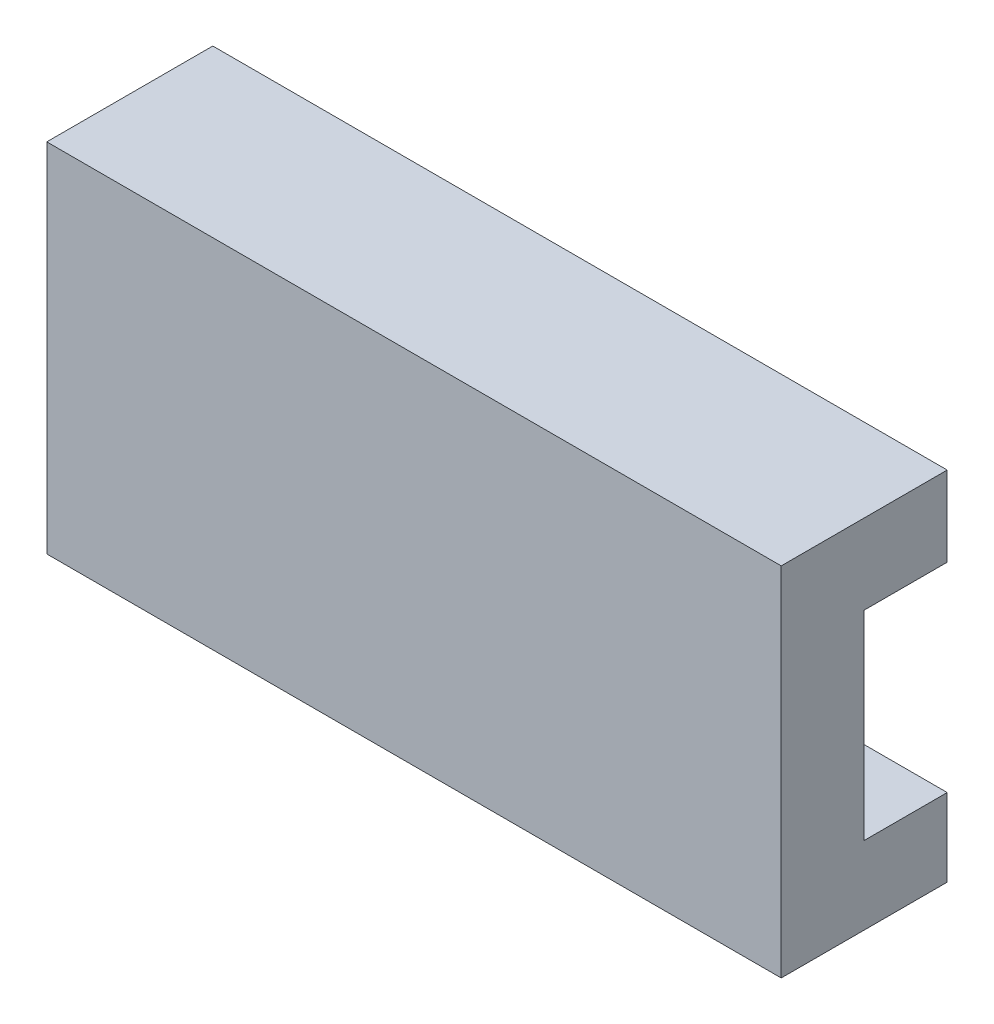
ISO-10303-21;
HEADER;
FILE_DESCRIPTION(('STEP AP214'),'2;1');
FILE_NAME('part.step','',(''),(''),'','','');
FILE_SCHEMA(('AUTOMOTIVE_DESIGN { 1 0 10303 214 1 1 1 1 }'));
ENDSEC;
DATA;
#1=APPLICATION_CONTEXT('core data for automotive mechanical design processes');
#2=APPLICATION_PROTOCOL_DEFINITION('international standard','automotive_design',2000,#1);
#3=PRODUCT_CONTEXT('',#1,'mechanical');
#4=PRODUCT('Part','Part','',(#3));
#5=PRODUCT_RELATED_PRODUCT_CATEGORY('part','',(#4));
#6=PRODUCT_DEFINITION_FORMATION('','',#4);
#7=PRODUCT_DEFINITION_CONTEXT('part definition',#1,'design');
#8=PRODUCT_DEFINITION('design','',#6,#7);
#9=PRODUCT_DEFINITION_SHAPE('','',#8);
#10=(LENGTH_UNIT() NAMED_UNIT(*) SI_UNIT(.MILLI.,.METRE.));
#11=(NAMED_UNIT(*) PLANE_ANGLE_UNIT() SI_UNIT($,.RADIAN.));
#12=(NAMED_UNIT(*) SI_UNIT($,.STERADIAN.) SOLID_ANGLE_UNIT());
#13=UNCERTAINTY_MEASURE_WITH_UNIT(LENGTH_MEASURE(1.E-05),#10,'distance_accuracy_value','');
#14=(GEOMETRIC_REPRESENTATION_CONTEXT(3) GLOBAL_UNCERTAINTY_ASSIGNED_CONTEXT((#13)) GLOBAL_UNIT_ASSIGNED_CONTEXT((#10,
#11,#12)) REPRESENTATION_CONTEXT('',''));
#15=CARTESIAN_POINT('',(0.,0.,0.));
#16=DIRECTION('',(0.,0.,1.));
#17=DIRECTION('',(1.,0.,0.));
#18=AXIS2_PLACEMENT_3D('',#15,#16,#17);
#19=CARTESIAN_POINT('',(22.1208181715247,12.7500000000001,10.));
#20=DIRECTION('',(-1.,0.,0.));
#21=DIRECTION('',(0.,-1.,0.));
#22=AXIS2_PLACEMENT_3D('',#19,#20,#21);
#23=PLANE('',#22);
#24=DIRECTION('',(0.,0.,-1.));
#25=VECTOR('',#24,1.);
#26=CARTESIAN_POINT('',(22.1208181715247,7.94147300772142,5.));
#27=LINE('',#26,#25);
#28=CARTESIAN_POINT('',(22.1208181715247,7.94147300772142,5.));
#29=VERTEX_POINT('',#28);
#30=CARTESIAN_POINT('',(22.1208181715247,7.94147300772142,0.));
#31=VERTEX_POINT('',#30);
#32=EDGE_CURVE('E121',#29,#31,#27,.T.);
#33=ORIENTED_EDGE('',*,*,#32,.T.);
#34=DIRECTION('',(0.,1.,0.));
#35=VECTOR('',#34,1.);
#36=CARTESIAN_POINT('',(22.1208181715247,12.7500000000001,0.));
#37=LINE('',#36,#35);
#38=CARTESIAN_POINT('',(22.1208181715247,12.7500000000001,0.));
#39=VERTEX_POINT('',#38);
#40=EDGE_CURVE('E127',#31,#39,#37,.T.);
#41=ORIENTED_EDGE('',*,*,#40,.T.);
#42=DIRECTION('',(0.,0.,-1.));
#43=VECTOR('',#42,1.);
#44=CARTESIAN_POINT('',(22.1208181715247,12.7500000000001,10.));
#45=LINE('',#44,#43);
#46=CARTESIAN_POINT('',(22.1208181715247,12.7500000000001,10.));
#47=VERTEX_POINT('',#46);
#48=EDGE_CURVE('E11',#47,#39,#45,.T.);
#49=ORIENTED_EDGE('',*,*,#48,.F.);
#50=DIRECTION('',(0.,1.,0.));
#51=VECTOR('',#50,1.);
#52=CARTESIAN_POINT('',(22.1208181715247,12.7500000000001,10.));
#53=LINE('',#52,#51);
#54=CARTESIAN_POINT('',(22.1208181715247,-8.74999999999985,10.));
#55=VERTEX_POINT('',#54);
#56=EDGE_CURVE('E144',#55,#47,#53,.T.);
#57=ORIENTED_EDGE('',*,*,#56,.F.);
#58=DIRECTION('',(0.,0.,-1.));
#59=VECTOR('',#58,1.);
#60=CARTESIAN_POINT('',(22.1208181715247,-8.74999999999985,10.));
#61=LINE('',#60,#59);
#62=CARTESIAN_POINT('',(22.1208181715247,-8.74999999999985,0.));
#63=VERTEX_POINT('',#62);
#64=EDGE_CURVE('E150',#55,#63,#61,.T.);
#65=ORIENTED_EDGE('',*,*,#64,.T.);
#66=CARTESIAN_POINT('',(22.1208181715247,-4.07454051597255,0.));
#67=VERTEX_POINT('',#66);
#68=EDGE_CURVE('E151',#63,#67,#37,.T.);
#69=ORIENTED_EDGE('',*,*,#68,.T.);
#70=DIRECTION('',(0.,0.,-1.));
#71=VECTOR('',#70,1.);
#72=CARTESIAN_POINT('',(22.1208181715247,-4.07454051597256,5.));
#73=LINE('',#72,#71);
#74=CARTESIAN_POINT('',(22.1208181715247,-4.07454051597256,5.));
#75=VERTEX_POINT('',#74);
#76=EDGE_CURVE('E50',#75,#67,#73,.T.);
#77=ORIENTED_EDGE('',*,*,#76,.F.);
#78=DIRECTION('',(0.,1.,0.));
#79=VECTOR('',#78,1.);
#80=CARTESIAN_POINT('',(22.1208181715247,-4.07454051597256,5.));
#81=LINE('',#80,#79);
#82=EDGE_CURVE('E114',#75,#29,#81,.T.);
#83=ORIENTED_EDGE('',*,*,#82,.T.);
#84=EDGE_LOOP('',(#33,#41,#49,#57,#65,#69,#77,#83));
#85=FACE_BOUND('',#84,.T.);
#86=ADVANCED_FACE('F36',(#85),#23,.F.);
#87=CARTESIAN_POINT('',(-22.1208181715247,12.7500000000001,10.));
#88=DIRECTION('',(1.,0.,0.));
#89=DIRECTION('',(0.,1.,0.));
#90=AXIS2_PLACEMENT_3D('',#87,#88,#89);
#91=PLANE('',#90);
#92=DIRECTION('',(0.,0.,-1.));
#93=VECTOR('',#92,1.);
#94=CARTESIAN_POINT('',(-22.1208181715247,7.94147300772142,5.));
#95=LINE('',#94,#93);
#96=CARTESIAN_POINT('',(-22.1208181715247,7.94147300772142,5.));
#97=VERTEX_POINT('',#96);
#98=CARTESIAN_POINT('',(-22.1208181715247,7.94147300772142,0.));
#99=VERTEX_POINT('',#98);
#100=EDGE_CURVE('E128',#97,#99,#95,.T.);
#101=ORIENTED_EDGE('',*,*,#100,.F.);
#102=DIRECTION('',(0.,-1.,0.));
#103=VECTOR('',#102,1.);
#104=CARTESIAN_POINT('',(-22.1208181715247,-4.07454051597256,5.));
#105=LINE('',#104,#103);
#106=CARTESIAN_POINT('',(-22.1208181715247,-4.07454051597256,5.));
#107=VERTEX_POINT('',#106);
#108=EDGE_CURVE('E116',#97,#107,#105,.T.);
#109=ORIENTED_EDGE('',*,*,#108,.T.);
#110=DIRECTION('',(0.,0.,-1.));
#111=VECTOR('',#110,1.);
#112=CARTESIAN_POINT('',(-22.1208181715247,-4.07454051597256,5.));
#113=LINE('',#112,#111);
#114=CARTESIAN_POINT('',(-22.1208181715247,-4.07454051597256,0.));
#115=VERTEX_POINT('',#114);
#116=EDGE_CURVE('E140',#107,#115,#113,.T.);
#117=ORIENTED_EDGE('',*,*,#116,.T.);
#118=DIRECTION('',(0.,-1.,0.));
#119=VECTOR('',#118,1.);
#120=CARTESIAN_POINT('',(-22.1208181715247,12.7500000000001,0.));
#121=LINE('',#120,#119);
#122=CARTESIAN_POINT('',(-22.1208181715247,-8.74999999999985,0.));
#123=VERTEX_POINT('',#122);
#124=EDGE_CURVE('E155',#115,#123,#121,.T.);
#125=ORIENTED_EDGE('',*,*,#124,.T.);
#126=DIRECTION('',(0.,0.,-1.));
#127=VECTOR('',#126,1.);
#128=CARTESIAN_POINT('',(-22.1208181715247,-8.74999999999985,10.));
#129=LINE('',#128,#127);
#130=CARTESIAN_POINT('',(-22.1208181715247,-8.74999999999985,10.));
#131=VERTEX_POINT('',#130);
#132=EDGE_CURVE('E161',#131,#123,#129,.T.);
#133=ORIENTED_EDGE('',*,*,#132,.F.);
#134=DIRECTION('',(0.,-1.,0.));
#135=VECTOR('',#134,1.);
#136=CARTESIAN_POINT('',(-22.1208181715247,12.7500000000001,10.));
#137=LINE('',#136,#135);
#138=CARTESIAN_POINT('',(-22.1208181715247,12.7500000000001,10.));
#139=VERTEX_POINT('',#138);
#140=EDGE_CURVE('E147',#139,#131,#137,.T.);
#141=ORIENTED_EDGE('',*,*,#140,.F.);
#142=DIRECTION('',(0.,0.,-1.));
#143=VECTOR('',#142,1.);
#144=CARTESIAN_POINT('',(-22.1208181715247,12.7500000000001,10.));
#145=LINE('',#144,#143);
#146=CARTESIAN_POINT('',(-22.1208181715247,12.7500000000001,0.));
#147=VERTEX_POINT('',#146);
#148=EDGE_CURVE('E43',#139,#147,#145,.T.);
#149=ORIENTED_EDGE('',*,*,#148,.T.);
#150=EDGE_CURVE('E156',#147,#99,#121,.T.);
#151=ORIENTED_EDGE('',*,*,#150,.T.);
#152=EDGE_LOOP('',(#101,#109,#117,#125,#133,#141,#149,#151));
#153=FACE_BOUND('',#152,.T.);
#154=ADVANCED_FACE('F166',(#153),#91,.F.);
#155=CARTESIAN_POINT('',(0.,0.,0.));
#156=DIRECTION('',(0.,0.,1.));
#157=DIRECTION('',(1.,0.,0.));
#158=AXIS2_PLACEMENT_3D('',#155,#156,#157);
#159=PLANE('',#158);
#160=DIRECTION('',(-1.,0.,0.));
#161=VECTOR('',#160,1.);
#162=CARTESIAN_POINT('',(-22.1208181715247,7.94147300772142,0.));
#163=LINE('',#162,#161);
#164=EDGE_CURVE('E124',#31,#99,#163,.T.);
#165=ORIENTED_EDGE('',*,*,#164,.T.);
#166=ORIENTED_EDGE('',*,*,#150,.F.);
#167=DIRECTION('',(-1.,0.,0.));
#168=VECTOR('',#167,1.);
#169=CARTESIAN_POINT('',(-22.1208181715247,12.7500000000001,0.));
#170=LINE('',#169,#168);
#171=EDGE_CURVE('E153',#39,#147,#170,.T.);
#172=ORIENTED_EDGE('',*,*,#171,.F.);
#173=ORIENTED_EDGE('',*,*,#40,.F.);
#174=EDGE_LOOP('',(#165,#166,#172,#173));
#175=FACE_BOUND('',#174,.T.);
#176=ADVANCED_FACE('F170',(#175),#159,.F.);
#177=DIRECTION('',(1.,0.,0.));
#178=VECTOR('',#177,1.);
#179=CARTESIAN_POINT('',(-22.1208181715247,-4.07454051597256,0.));
#180=LINE('',#179,#178);
#181=EDGE_CURVE('E131',#115,#67,#180,.T.);
#182=ORIENTED_EDGE('',*,*,#181,.T.);
#183=ORIENTED_EDGE('',*,*,#68,.F.);
#184=DIRECTION('',(1.,0.,0.));
#185=VECTOR('',#184,1.);
#186=CARTESIAN_POINT('',(-22.1208181715247,-8.74999999999985,0.));
#187=LINE('',#186,#185);
#188=EDGE_CURVE('E80',#123,#63,#187,.T.);
#189=ORIENTED_EDGE('',*,*,#188,.F.);
#190=ORIENTED_EDGE('',*,*,#124,.F.);
#191=EDGE_LOOP('',(#182,#183,#189,#190));
#192=FACE_BOUND('',#191,.T.);
#193=ADVANCED_FACE('F176',(#192),#159,.F.);
#194=CARTESIAN_POINT('',(-22.1208181715247,12.7500000000001,10.));
#195=DIRECTION('',(0.,-1.,0.));
#196=DIRECTION('',(0.,0.,-1.));
#197=AXIS2_PLACEMENT_3D('',#194,#195,#196);
#198=PLANE('',#197);
#199=ORIENTED_EDGE('',*,*,#171,.T.);
#200=ORIENTED_EDGE('',*,*,#148,.F.);
#201=DIRECTION('',(-1.,0.,0.));
#202=VECTOR('',#201,1.);
#203=CARTESIAN_POINT('',(-22.1208181715247,12.7500000000001,10.));
#204=LINE('',#203,#202);
#205=EDGE_CURVE('E87',#47,#139,#204,.T.);
#206=ORIENTED_EDGE('',*,*,#205,.F.);
#207=ORIENTED_EDGE('',*,*,#48,.T.);
#208=EDGE_LOOP('',(#199,#200,#206,#207));
#209=FACE_BOUND('',#208,.T.);
#210=ADVANCED_FACE('F173',(#209),#198,.F.);
#211=CARTESIAN_POINT('',(-22.1208181715247,-8.74999999999985,10.));
#212=DIRECTION('',(0.,1.,0.));
#213=DIRECTION('',(-1.,0.,0.));
#214=AXIS2_PLACEMENT_3D('',#211,#212,#213);
#215=PLANE('',#214);
#216=ORIENTED_EDGE('',*,*,#188,.T.);
#217=ORIENTED_EDGE('',*,*,#64,.F.);
#218=DIRECTION('',(1.,0.,0.));
#219=VECTOR('',#218,1.);
#220=CARTESIAN_POINT('',(-22.1208181715247,-8.74999999999985,10.));
#221=LINE('',#220,#219);
#222=EDGE_CURVE('E59',#131,#55,#221,.T.);
#223=ORIENTED_EDGE('',*,*,#222,.F.);
#224=ORIENTED_EDGE('',*,*,#132,.T.);
#225=EDGE_LOOP('',(#216,#217,#223,#224));
#226=FACE_BOUND('',#225,.T.);
#227=ADVANCED_FACE('F175',(#226),#215,.F.);
#228=CARTESIAN_POINT('',(0.,0.,10.));
#229=DIRECTION('',(0.,0.,1.));
#230=DIRECTION('',(1.,0.,0.));
#231=AXIS2_PLACEMENT_3D('',#228,#229,#230);
#232=PLANE('',#231);
#233=ORIENTED_EDGE('',*,*,#56,.T.);
#234=ORIENTED_EDGE('',*,*,#205,.T.);
#235=ORIENTED_EDGE('',*,*,#140,.T.);
#236=ORIENTED_EDGE('',*,*,#222,.T.);
#237=EDGE_LOOP('',(#233,#234,#235,#236));
#238=FACE_BOUND('',#237,.T.);
#239=ADVANCED_FACE('F181',(#238),#232,.T.);
#240=CARTESIAN_POINT('',(-22.1208181715247,7.94147300772142,5.));
#241=DIRECTION('',(0.,-1.,0.));
#242=DIRECTION('',(0.,0.,-1.));
#243=AXIS2_PLACEMENT_3D('',#240,#241,#242);
#244=PLANE('',#243);
#245=ORIENTED_EDGE('',*,*,#164,.F.);
#246=ORIENTED_EDGE('',*,*,#32,.F.);
#247=DIRECTION('',(-1.,0.,0.));
#248=VECTOR('',#247,1.);
#249=CARTESIAN_POINT('',(-22.1208181715247,7.94147300772142,5.));
#250=LINE('',#249,#248);
#251=EDGE_CURVE('E109',#29,#97,#250,.T.);
#252=ORIENTED_EDGE('',*,*,#251,.T.);
#253=ORIENTED_EDGE('',*,*,#100,.T.);
#254=EDGE_LOOP('',(#245,#246,#252,#253));
#255=FACE_BOUND('',#254,.T.);
#256=ADVANCED_FACE('F122',(#255),#244,.T.);
#257=CARTESIAN_POINT('',(-22.1208181715247,-4.07454051597256,5.));
#258=DIRECTION('',(0.,1.,0.));
#259=DIRECTION('',(0.,0.,1.));
#260=AXIS2_PLACEMENT_3D('',#257,#258,#259);
#261=PLANE('',#260);
#262=ORIENTED_EDGE('',*,*,#181,.F.);
#263=ORIENTED_EDGE('',*,*,#116,.F.);
#264=DIRECTION('',(1.,0.,0.));
#265=VECTOR('',#264,1.);
#266=CARTESIAN_POINT('',(-22.1208181715247,-4.07454051597256,5.));
#267=LINE('',#266,#265);
#268=EDGE_CURVE('E136',#107,#75,#267,.T.);
#269=ORIENTED_EDGE('',*,*,#268,.T.);
#270=ORIENTED_EDGE('',*,*,#76,.T.);
#271=EDGE_LOOP('',(#262,#263,#269,#270));
#272=FACE_BOUND('',#271,.T.);
#273=ADVANCED_FACE('F198',(#272),#261,.T.);
#274=CARTESIAN_POINT('',(0.,0.,5.));
#275=DIRECTION('',(0.,0.,-1.));
#276=DIRECTION('',(-1.,0.,0.));
#277=AXIS2_PLACEMENT_3D('',#274,#275,#276);
#278=PLANE('',#277);
#279=ORIENTED_EDGE('',*,*,#82,.F.);
#280=ORIENTED_EDGE('',*,*,#268,.F.);
#281=ORIENTED_EDGE('',*,*,#108,.F.);
#282=ORIENTED_EDGE('',*,*,#251,.F.);
#283=EDGE_LOOP('',(#279,#280,#281,#282));
#284=FACE_BOUND('',#283,.T.);
#285=ADVANCED_FACE('F111',(#284),#278,.T.);
#286=CLOSED_SHELL('',(#86,#154,#176,#193,#210,#227,#239,#256,#273,#285));
#287=MANIFOLD_SOLID_BREP('B2',#286);
#288=ADVANCED_BREP_SHAPE_REPRESENTATION('',(#18,#287),#14);
#289=SHAPE_DEFINITION_REPRESENTATION(#9,#288);
ENDSEC;
END-ISO-10303-21;
